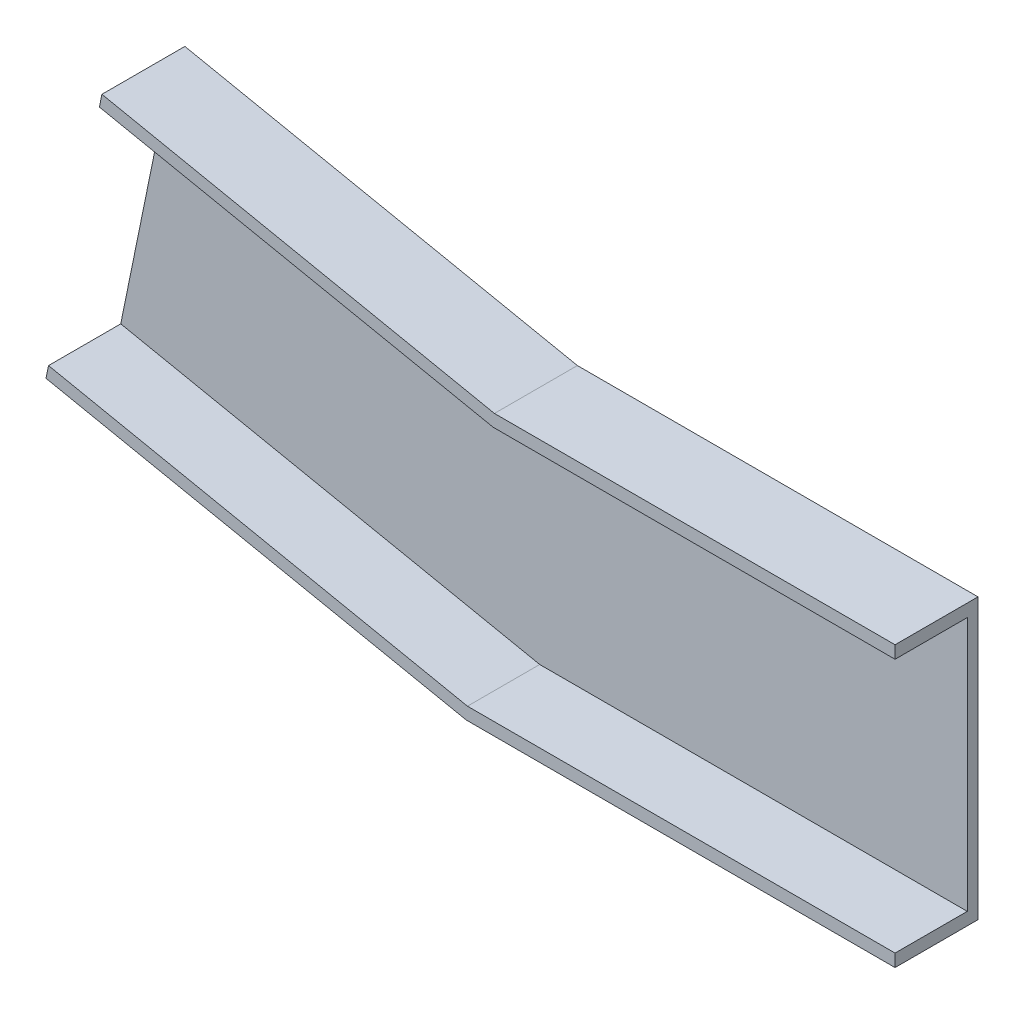
ISO-10303-21;
HEADER;
FILE_DESCRIPTION(('STEP AP214'),'2;1');
FILE_NAME('part.step','',(''),(''),'','','');
FILE_SCHEMA(('AUTOMOTIVE_DESIGN { 1 0 10303 214 1 1 1 1 }'));
ENDSEC;
DATA;
#1=APPLICATION_CONTEXT('core data for automotive mechanical design processes');
#2=APPLICATION_PROTOCOL_DEFINITION('international standard','automotive_design',2000,#1);
#3=PRODUCT_CONTEXT('',#1,'mechanical');
#4=PRODUCT('Part','Part','',(#3));
#5=PRODUCT_RELATED_PRODUCT_CATEGORY('part','',(#4));
#6=PRODUCT_DEFINITION_FORMATION('','',#4);
#7=PRODUCT_DEFINITION_CONTEXT('part definition',#1,'design');
#8=PRODUCT_DEFINITION('design','',#6,#7);
#9=PRODUCT_DEFINITION_SHAPE('','',#8);
#10=(LENGTH_UNIT() NAMED_UNIT(*) SI_UNIT(.MILLI.,.METRE.));
#11=(NAMED_UNIT(*) PLANE_ANGLE_UNIT() SI_UNIT($,.RADIAN.));
#12=(NAMED_UNIT(*) SI_UNIT($,.STERADIAN.) SOLID_ANGLE_UNIT());
#13=UNCERTAINTY_MEASURE_WITH_UNIT(LENGTH_MEASURE(1.E-05),#10,'distance_accuracy_value','');
#14=(GEOMETRIC_REPRESENTATION_CONTEXT(3) GLOBAL_UNCERTAINTY_ASSIGNED_CONTEXT((#13)) GLOBAL_UNIT_ASSIGNED_CONTEXT((#10,
#11,#12)) REPRESENTATION_CONTEXT('',''));
#15=CARTESIAN_POINT('',(0.,0.,0.));
#16=DIRECTION('',(0.,0.,1.));
#17=DIRECTION('',(1.,0.,0.));
#18=AXIS2_PLACEMENT_3D('',#15,#16,#17);
#19=CARTESIAN_POINT('',(0.,0.,89.));
#20=DIRECTION('',(0.,0.,-1.));
#21=DIRECTION('',(-1.,0.,0.));
#22=AXIS2_PLACEMENT_3D('',#19,#20,#21);
#23=PLANE('',#22);
#24=DIRECTION('',(-0.2,-0.979795897113271,0.));
#25=VECTOR('',#24,1.);
#26=CARTESIAN_POINT('',(-406.009174215406,235.969384566991,89.));
#27=LINE('',#26,#25);
#28=CARTESIAN_POINT('',(-406.009174215406,235.969384566991,89.));
#29=VERTEX_POINT('',#28);
#30=CARTESIAN_POINT('',(-408.709174215406,222.742139955962,89.));
#31=VERTEX_POINT('',#30);
#32=EDGE_CURVE('E112',#29,#31,#27,.T.);
#33=ORIENTED_EDGE('',*,*,#32,.T.);
#34=DIRECTION('',(-0.979795897113271,0.2,0.));
#35=VECTOR('',#34,1.);
#36=CARTESIAN_POINT('',(-408.709174215406,222.742139955962,89.));
#37=LINE('',#36,#35);
#38=CARTESIAN_POINT('',(13.789300220192,136.5,89.));
#39=VERTEX_POINT('',#38);
#40=EDGE_CURVE('E191',#39,#31,#37,.T.);
#41=ORIENTED_EDGE('',*,*,#40,.F.);
#42=DIRECTION('',(-1.,0.,0.));
#43=VECTOR('',#42,1.);
#44=CARTESIAN_POINT('',(13.789300220192,136.5,89.));
#45=LINE('',#44,#43);
#46=CARTESIAN_POINT('',(445.,136.5,89.));
#47=VERTEX_POINT('',#46);
#48=EDGE_CURVE('E214',#47,#39,#45,.T.);
#49=ORIENTED_EDGE('',*,*,#48,.F.);
#50=DIRECTION('',(0.,1.,0.));
#51=VECTOR('',#50,1.);
#52=CARTESIAN_POINT('',(445.,150.,89.));
#53=LINE('',#52,#51);
#54=CARTESIAN_POINT('',(445.,150.,89.));
#55=VERTEX_POINT('',#54);
#56=EDGE_CURVE('E92',#47,#55,#53,.T.);
#57=ORIENTED_EDGE('',*,*,#56,.T.);
#58=DIRECTION('',(-1.,0.,0.));
#59=VECTOR('',#58,1.);
#60=CARTESIAN_POINT('',(15.1530771650462,150.,89.));
#61=LINE('',#60,#59);
#62=CARTESIAN_POINT('',(15.1530771650462,150.,89.));
#63=VERTEX_POINT('',#62);
#64=EDGE_CURVE('E168',#55,#63,#61,.T.);
#65=ORIENTED_EDGE('',*,*,#64,.T.);
#66=DIRECTION('',(-0.979795897113271,0.2,0.));
#67=VECTOR('',#66,1.);
#68=CARTESIAN_POINT('',(15.1530771650462,150.,89.));
#69=LINE('',#68,#67);
#70=EDGE_CURVE('E113',#63,#29,#69,.T.);
#71=ORIENTED_EDGE('',*,*,#70,.T.);
#72=EDGE_LOOP('',(#33,#41,#49,#57,#65,#71));
#73=FACE_BOUND('',#72,.T.);
#74=ADVANCED_FACE('F32',(#73),#23,.F.);
#75=CARTESIAN_POINT('',(445.,150.,89.));
#76=DIRECTION('',(-1.,0.,0.));
#77=DIRECTION('',(0.,0.,1.));
#78=AXIS2_PLACEMENT_3D('',#75,#76,#77);
#79=PLANE('',#78);
#80=ORIENTED_EDGE('',*,*,#56,.F.);
#81=DIRECTION('',(0.,0.,1.));
#82=VECTOR('',#81,1.);
#83=CARTESIAN_POINT('',(445.,136.5,11.5));
#84=LINE('',#83,#82);
#85=CARTESIAN_POINT('',(445.,136.5,11.5));
#86=VERTEX_POINT('',#85);
#87=EDGE_CURVE('E188',#86,#47,#84,.T.);
#88=ORIENTED_EDGE('',*,*,#87,.F.);
#89=DIRECTION('',(0.,1.,0.));
#90=VECTOR('',#89,1.);
#91=CARTESIAN_POINT('',(445.,136.5,11.5));
#92=LINE('',#91,#90);
#93=CARTESIAN_POINT('',(445.,-136.5,11.5));
#94=VERTEX_POINT('',#93);
#95=EDGE_CURVE('E208',#94,#86,#92,.T.);
#96=ORIENTED_EDGE('',*,*,#95,.F.);
#97=DIRECTION('',(0.,0.,1.));
#98=VECTOR('',#97,1.);
#99=CARTESIAN_POINT('',(445.,-136.5,11.5));
#100=LINE('',#99,#98);
#101=CARTESIAN_POINT('',(445.,-136.5,89.));
#102=VERTEX_POINT('',#101);
#103=EDGE_CURVE('E167',#94,#102,#100,.T.);
#104=ORIENTED_EDGE('',*,*,#103,.T.);
#105=CARTESIAN_POINT('',(445.,-150.,89.));
#106=VERTEX_POINT('',#105);
#107=EDGE_CURVE('E163',#106,#102,#53,.T.);
#108=ORIENTED_EDGE('',*,*,#107,.F.);
#109=DIRECTION('',(0.,0.,-1.));
#110=VECTOR('',#109,1.);
#111=CARTESIAN_POINT('',(445.,-150.,89.));
#112=LINE('',#111,#110);
#113=CARTESIAN_POINT('',(445.,-150.,0.));
#114=VERTEX_POINT('',#113);
#115=EDGE_CURVE('E129',#106,#114,#112,.T.);
#116=ORIENTED_EDGE('',*,*,#115,.T.);
#117=DIRECTION('',(0.,1.,0.));
#118=VECTOR('',#117,1.);
#119=CARTESIAN_POINT('',(445.,150.,0.));
#120=LINE('',#119,#118);
#121=CARTESIAN_POINT('',(445.,150.,0.));
#122=VERTEX_POINT('',#121);
#123=EDGE_CURVE('E134',#114,#122,#120,.T.);
#124=ORIENTED_EDGE('',*,*,#123,.T.);
#125=DIRECTION('',(0.,0.,-1.));
#126=VECTOR('',#125,1.);
#127=CARTESIAN_POINT('',(445.,150.,89.));
#128=LINE('',#127,#126);
#129=EDGE_CURVE('E11',#55,#122,#128,.T.);
#130=ORIENTED_EDGE('',*,*,#129,.F.);
#131=EDGE_LOOP('',(#80,#88,#96,#104,#108,#116,#124,#130));
#132=FACE_BOUND('',#131,.T.);
#133=ADVANCED_FACE('F34',(#132),#79,.F.);
#134=CARTESIAN_POINT('',(15.1530771650462,150.,89.));
#135=DIRECTION('',(0.,-1.,0.));
#136=DIRECTION('',(1.,0.,0.));
#137=AXIS2_PLACEMENT_3D('',#134,#135,#136);
#138=PLANE('',#137);
#139=DIRECTION('',(-1.,0.,0.));
#140=VECTOR('',#139,1.);
#141=CARTESIAN_POINT('',(15.1530771650462,150.,0.));
#142=LINE('',#141,#140);
#143=CARTESIAN_POINT('',(15.1530771650462,150.,0.));
#144=VERTEX_POINT('',#143);
#145=EDGE_CURVE('E137',#122,#144,#142,.T.);
#146=ORIENTED_EDGE('',*,*,#145,.T.);
#147=DIRECTION('',(0.,0.,-1.));
#148=VECTOR('',#147,1.);
#149=CARTESIAN_POINT('',(15.1530771650462,150.,89.));
#150=LINE('',#149,#148);
#151=EDGE_CURVE('E40',#63,#144,#150,.T.);
#152=ORIENTED_EDGE('',*,*,#151,.F.);
#153=ORIENTED_EDGE('',*,*,#64,.F.);
#154=ORIENTED_EDGE('',*,*,#129,.T.);
#155=EDGE_LOOP('',(#146,#152,#153,#154));
#156=FACE_BOUND('',#155,.T.);
#157=ADVANCED_FACE('F261',(#156),#138,.F.);
#158=CARTESIAN_POINT('',(15.1530771650462,150.,89.));
#159=DIRECTION('',(-0.2,-0.979795897113271,0.));
#160=DIRECTION('',(0.979795897113271,-0.2,0.));
#161=AXIS2_PLACEMENT_3D('',#158,#159,#160);
#162=PLANE('',#161);
#163=DIRECTION('',(-0.979795897113271,0.2,0.));
#164=VECTOR('',#163,1.);
#165=CARTESIAN_POINT('',(15.1530771650462,150.,0.));
#166=LINE('',#165,#164);
#167=CARTESIAN_POINT('',(-406.009174215406,235.969384566991,0.));
#168=VERTEX_POINT('',#167);
#169=EDGE_CURVE('E140',#144,#168,#166,.T.);
#170=ORIENTED_EDGE('',*,*,#169,.T.);
#171=DIRECTION('',(0.,0.,-1.));
#172=VECTOR('',#171,1.);
#173=CARTESIAN_POINT('',(-406.009174215406,235.969384566991,89.));
#174=LINE('',#173,#172);
#175=EDGE_CURVE('E124',#29,#168,#174,.T.);
#176=ORIENTED_EDGE('',*,*,#175,.F.);
#177=ORIENTED_EDGE('',*,*,#70,.F.);
#178=ORIENTED_EDGE('',*,*,#151,.T.);
#179=EDGE_LOOP('',(#170,#176,#177,#178));
#180=FACE_BOUND('',#179,.T.);
#181=ADVANCED_FACE('F153',(#180),#162,.F.);
#182=CARTESIAN_POINT('',(-406.009174215406,235.969384566991,89.));
#183=DIRECTION('',(0.979795897113271,-0.2,0.));
#184=DIRECTION('',(0.2,0.979795897113271,0.));
#185=AXIS2_PLACEMENT_3D('',#182,#183,#184);
#186=PLANE('',#185);
#187=DIRECTION('',(-0.2,-0.979795897113271,0.));
#188=VECTOR('',#187,1.);
#189=CARTESIAN_POINT('',(-463.309174215406,-44.7421399559615,11.5));
#190=LINE('',#189,#188);
#191=CARTESIAN_POINT('',(-408.709174215406,222.742139955962,11.5));
#192=VERTEX_POINT('',#191);
#193=CARTESIAN_POINT('',(-463.309174215406,-44.7421399559615,11.5));
#194=VERTEX_POINT('',#193);
#195=EDGE_CURVE('E178',#192,#194,#190,.T.);
#196=ORIENTED_EDGE('',*,*,#195,.F.);
#197=DIRECTION('',(0.,0.,1.));
#198=VECTOR('',#197,1.);
#199=CARTESIAN_POINT('',(-408.709174215406,222.742139955962,11.5));
#200=LINE('',#199,#198);
#201=EDGE_CURVE('E138',#192,#31,#200,.T.);
#202=ORIENTED_EDGE('',*,*,#201,.T.);
#203=ORIENTED_EDGE('',*,*,#32,.F.);
#204=ORIENTED_EDGE('',*,*,#175,.T.);
#205=DIRECTION('',(-0.2,-0.979795897113271,0.));
#206=VECTOR('',#205,1.);
#207=CARTESIAN_POINT('',(-406.009174215406,235.969384566991,0.));
#208=LINE('',#207,#206);
#209=CARTESIAN_POINT('',(-466.009174215406,-57.9693845669907,0.));
#210=VERTEX_POINT('',#209);
#211=EDGE_CURVE('E121',#168,#210,#208,.T.);
#212=ORIENTED_EDGE('',*,*,#211,.T.);
#213=DIRECTION('',(0.,0.,-1.));
#214=VECTOR('',#213,1.);
#215=CARTESIAN_POINT('',(-466.009174215406,-57.9693845669907,89.));
#216=LINE('',#215,#214);
#217=CARTESIAN_POINT('',(-466.009174215406,-57.9693845669907,89.));
#218=VERTEX_POINT('',#217);
#219=EDGE_CURVE('E116',#218,#210,#216,.T.);
#220=ORIENTED_EDGE('',*,*,#219,.F.);
#221=CARTESIAN_POINT('',(-463.309174215406,-44.7421399559614,89.));
#222=VERTEX_POINT('',#221);
#223=EDGE_CURVE('E103',#222,#218,#27,.T.);
#224=ORIENTED_EDGE('',*,*,#223,.F.);
#225=DIRECTION('',(0.,0.,1.));
#226=VECTOR('',#225,1.);
#227=CARTESIAN_POINT('',(-463.309174215406,-44.7421399559615,11.5));
#228=LINE('',#227,#226);
#229=EDGE_CURVE('E47',#194,#222,#228,.T.);
#230=ORIENTED_EDGE('',*,*,#229,.F.);
#231=EDGE_LOOP('',(#196,#202,#203,#204,#212,#220,#224,#230));
#232=FACE_BOUND('',#231,.T.);
#233=ADVANCED_FACE('F118',(#232),#186,.F.);
#234=CARTESIAN_POINT('',(-466.009174215406,-57.9693845669907,89.));
#235=DIRECTION('',(0.2,0.979795897113271,0.));
#236=DIRECTION('',(-0.979795897113271,0.2,0.));
#237=AXIS2_PLACEMENT_3D('',#234,#235,#236);
#238=PLANE('',#237);
#239=DIRECTION('',(0.979795897113271,-0.2,0.));
#240=VECTOR('',#239,1.);
#241=CARTESIAN_POINT('',(-466.009174215406,-57.9693845669907,0.));
#242=LINE('',#241,#240);
#243=CARTESIAN_POINT('',(-15.1530771650465,-150.,0.));
#244=VERTEX_POINT('',#243);
#245=EDGE_CURVE('E143',#210,#244,#242,.T.);
#246=ORIENTED_EDGE('',*,*,#245,.T.);
#247=DIRECTION('',(0.,0.,-1.));
#248=VECTOR('',#247,1.);
#249=CARTESIAN_POINT('',(-15.1530771650465,-150.,89.));
#250=LINE('',#249,#248);
#251=CARTESIAN_POINT('',(-15.1530771650465,-150.,89.));
#252=VERTEX_POINT('',#251);
#253=EDGE_CURVE('E125',#252,#244,#250,.T.);
#254=ORIENTED_EDGE('',*,*,#253,.F.);
#255=DIRECTION('',(0.979795897113271,-0.2,0.));
#256=VECTOR('',#255,1.);
#257=CARTESIAN_POINT('',(-466.009174215406,-57.9693845669907,89.));
#258=LINE('',#257,#256);
#259=EDGE_CURVE('E107',#218,#252,#258,.T.);
#260=ORIENTED_EDGE('',*,*,#259,.F.);
#261=ORIENTED_EDGE('',*,*,#219,.T.);
#262=EDGE_LOOP('',(#246,#254,#260,#261));
#263=FACE_BOUND('',#262,.T.);
#264=ADVANCED_FACE('F127',(#263),#238,.F.);
#265=CARTESIAN_POINT('',(445.,-150.,89.));
#266=DIRECTION('',(0.,1.,0.));
#267=DIRECTION('',(0.,0.,1.));
#268=AXIS2_PLACEMENT_3D('',#265,#266,#267);
#269=PLANE('',#268);
#270=DIRECTION('',(1.,0.,0.));
#271=VECTOR('',#270,1.);
#272=CARTESIAN_POINT('',(445.,-150.,0.));
#273=LINE('',#272,#271);
#274=EDGE_CURVE('E83',#244,#114,#273,.T.);
#275=ORIENTED_EDGE('',*,*,#274,.T.);
#276=ORIENTED_EDGE('',*,*,#115,.F.);
#277=DIRECTION('',(1.,0.,0.));
#278=VECTOR('',#277,1.);
#279=CARTESIAN_POINT('',(445.,-150.,89.));
#280=LINE('',#279,#278);
#281=EDGE_CURVE('E56',#252,#106,#280,.T.);
#282=ORIENTED_EDGE('',*,*,#281,.F.);
#283=ORIENTED_EDGE('',*,*,#253,.T.);
#284=EDGE_LOOP('',(#275,#276,#282,#283));
#285=FACE_BOUND('',#284,.T.);
#286=ADVANCED_FACE('F159',(#285),#269,.F.);
#287=ORIENTED_EDGE('',*,*,#107,.T.);
#288=DIRECTION('',(1.,0.,0.));
#289=VECTOR('',#288,1.);
#290=CARTESIAN_POINT('',(445.,-136.5,89.));
#291=LINE('',#290,#289);
#292=CARTESIAN_POINT('',(-13.7893002201923,-136.5,89.));
#293=VERTEX_POINT('',#292);
#294=EDGE_CURVE('E213',#293,#102,#291,.T.);
#295=ORIENTED_EDGE('',*,*,#294,.F.);
#296=DIRECTION('',(0.979795897113271,-0.2,0.));
#297=VECTOR('',#296,1.);
#298=CARTESIAN_POINT('',(-13.7893002201923,-136.5,89.));
#299=LINE('',#298,#297);
#300=EDGE_CURVE('E110',#222,#293,#299,.T.);
#301=ORIENTED_EDGE('',*,*,#300,.F.);
#302=ORIENTED_EDGE('',*,*,#223,.T.);
#303=ORIENTED_EDGE('',*,*,#259,.T.);
#304=ORIENTED_EDGE('',*,*,#281,.T.);
#305=EDGE_LOOP('',(#287,#295,#301,#302,#303,#304));
#306=FACE_BOUND('',#305,.T.);
#307=ADVANCED_FACE('F105',(#306),#23,.F.);
#308=CARTESIAN_POINT('',(0.,0.,0.));
#309=DIRECTION('',(0.,0.,-1.));
#310=DIRECTION('',(-1.,0.,0.));
#311=AXIS2_PLACEMENT_3D('',#308,#309,#310);
#312=PLANE('',#311);
#313=ORIENTED_EDGE('',*,*,#123,.F.);
#314=ORIENTED_EDGE('',*,*,#274,.F.);
#315=ORIENTED_EDGE('',*,*,#245,.F.);
#316=ORIENTED_EDGE('',*,*,#211,.F.);
#317=ORIENTED_EDGE('',*,*,#169,.F.);
#318=ORIENTED_EDGE('',*,*,#145,.F.);
#319=EDGE_LOOP('',(#313,#314,#315,#316,#317,#318));
#320=FACE_BOUND('',#319,.T.);
#321=ADVANCED_FACE('F158',(#320),#312,.T.);
#322=CARTESIAN_POINT('',(-408.709174215406,222.742139955962,11.5));
#323=DIRECTION('',(0.2,0.979795897113271,0.));
#324=DIRECTION('',(-0.979795897113271,0.2,0.));
#325=AXIS2_PLACEMENT_3D('',#322,#323,#324);
#326=PLANE('',#325);
#327=ORIENTED_EDGE('',*,*,#40,.T.);
#328=ORIENTED_EDGE('',*,*,#201,.F.);
#329=DIRECTION('',(-0.979795897113271,0.2,0.));
#330=VECTOR('',#329,1.);
#331=CARTESIAN_POINT('',(-408.709174215406,222.742139955962,11.5));
#332=LINE('',#331,#330);
#333=CARTESIAN_POINT('',(13.789300220192,136.5,11.5));
#334=VERTEX_POINT('',#333);
#335=EDGE_CURVE('E203',#334,#192,#332,.T.);
#336=ORIENTED_EDGE('',*,*,#335,.F.);
#337=DIRECTION('',(0.,0.,1.));
#338=VECTOR('',#337,1.);
#339=CARTESIAN_POINT('',(13.789300220192,136.5,11.5));
#340=LINE('',#339,#338);
#341=EDGE_CURVE('E185',#334,#39,#340,.T.);
#342=ORIENTED_EDGE('',*,*,#341,.T.);
#343=EDGE_LOOP('',(#327,#328,#336,#342));
#344=FACE_BOUND('',#343,.T.);
#345=ADVANCED_FACE('F254',(#344),#326,.F.);
#346=CARTESIAN_POINT('',(13.789300220192,136.5,11.5));
#347=DIRECTION('',(0.,1.,0.));
#348=DIRECTION('',(-1.,0.,0.));
#349=AXIS2_PLACEMENT_3D('',#346,#347,#348);
#350=PLANE('',#349);
#351=ORIENTED_EDGE('',*,*,#48,.T.);
#352=ORIENTED_EDGE('',*,*,#341,.F.);
#353=DIRECTION('',(-1.,0.,0.));
#354=VECTOR('',#353,1.);
#355=CARTESIAN_POINT('',(13.789300220192,136.5,11.5));
#356=LINE('',#355,#354);
#357=EDGE_CURVE('E204',#86,#334,#356,.T.);
#358=ORIENTED_EDGE('',*,*,#357,.F.);
#359=ORIENTED_EDGE('',*,*,#87,.T.);
#360=EDGE_LOOP('',(#351,#352,#358,#359));
#361=FACE_BOUND('',#360,.T.);
#362=ADVANCED_FACE('F235',(#361),#350,.F.);
#363=CARTESIAN_POINT('',(445.,-136.5,11.5));
#364=DIRECTION('',(0.,-1.,0.));
#365=DIRECTION('',(1.,0.,0.));
#366=AXIS2_PLACEMENT_3D('',#363,#364,#365);
#367=PLANE('',#366);
#368=ORIENTED_EDGE('',*,*,#294,.T.);
#369=ORIENTED_EDGE('',*,*,#103,.F.);
#370=DIRECTION('',(1.,0.,0.));
#371=VECTOR('',#370,1.);
#372=CARTESIAN_POINT('',(445.,-136.5,11.5));
#373=LINE('',#372,#371);
#374=CARTESIAN_POINT('',(-13.7893002201923,-136.5,11.5));
#375=VERTEX_POINT('',#374);
#376=EDGE_CURVE('E221',#375,#94,#373,.T.);
#377=ORIENTED_EDGE('',*,*,#376,.F.);
#378=DIRECTION('',(0.,0.,1.));
#379=VECTOR('',#378,1.);
#380=CARTESIAN_POINT('',(-13.7893002201923,-136.5,11.5));
#381=LINE('',#380,#379);
#382=EDGE_CURVE('E196',#375,#293,#381,.T.);
#383=ORIENTED_EDGE('',*,*,#382,.T.);
#384=EDGE_LOOP('',(#368,#369,#377,#383));
#385=FACE_BOUND('',#384,.T.);
#386=ADVANCED_FACE('F246',(#385),#367,.F.);
#387=CARTESIAN_POINT('',(-13.7893002201923,-136.5,11.5));
#388=DIRECTION('',(-0.2,-0.979795897113271,0.));
#389=DIRECTION('',(0.979795897113271,-0.2,0.));
#390=AXIS2_PLACEMENT_3D('',#387,#388,#389);
#391=PLANE('',#390);
#392=ORIENTED_EDGE('',*,*,#300,.T.);
#393=ORIENTED_EDGE('',*,*,#382,.F.);
#394=DIRECTION('',(0.979795897113271,-0.2,0.));
#395=VECTOR('',#394,1.);
#396=CARTESIAN_POINT('',(-13.7893002201923,-136.5,11.5));
#397=LINE('',#396,#395);
#398=EDGE_CURVE('E218',#194,#375,#397,.T.);
#399=ORIENTED_EDGE('',*,*,#398,.F.);
#400=ORIENTED_EDGE('',*,*,#229,.T.);
#401=EDGE_LOOP('',(#392,#393,#399,#400));
#402=FACE_BOUND('',#401,.T.);
#403=ADVANCED_FACE('F245',(#402),#391,.F.);
#404=CARTESIAN_POINT('',(0.,0.,11.5));
#405=DIRECTION('',(0.,0.,-1.));
#406=DIRECTION('',(-1.,0.,0.));
#407=AXIS2_PLACEMENT_3D('',#404,#405,#406);
#408=PLANE('',#407);
#409=ORIENTED_EDGE('',*,*,#195,.T.);
#410=ORIENTED_EDGE('',*,*,#398,.T.);
#411=ORIENTED_EDGE('',*,*,#376,.T.);
#412=ORIENTED_EDGE('',*,*,#95,.T.);
#413=ORIENTED_EDGE('',*,*,#357,.T.);
#414=ORIENTED_EDGE('',*,*,#335,.T.);
#415=EDGE_LOOP('',(#409,#410,#411,#412,#413,#414));
#416=FACE_BOUND('',#415,.T.);
#417=ADVANCED_FACE('F228',(#416),#408,.F.);
#418=CLOSED_SHELL('',(#74,#133,#157,#181,#233,#264,#286,#307,#321,#345,#362,#386,#403,#417));
#419=MANIFOLD_SOLID_BREP('B2',#418);
#420=ADVANCED_BREP_SHAPE_REPRESENTATION('',(#18,#419),#14);
#421=SHAPE_DEFINITION_REPRESENTATION(#9,#420);
ENDSEC;
END-ISO-10303-21;
